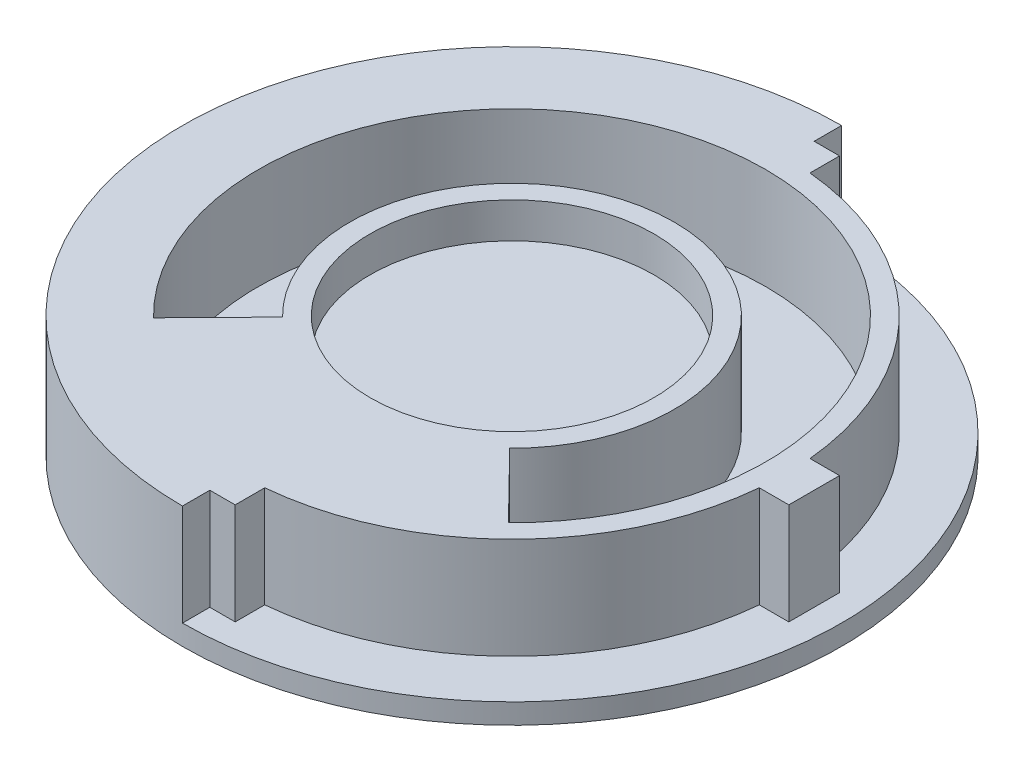
ISO-10303-21;
HEADER;
FILE_DESCRIPTION(('STEP AP214'),'2;1');
FILE_NAME('part.step','',(''),(''),'','','');
FILE_SCHEMA(('AUTOMOTIVE_DESIGN { 1 0 10303 214 1 1 1 1 }'));
ENDSEC;
DATA;
#1=APPLICATION_CONTEXT('core data for automotive mechanical design processes');
#2=APPLICATION_PROTOCOL_DEFINITION('international standard','automotive_design',2000,#1);
#3=PRODUCT_CONTEXT('',#1,'mechanical');
#4=PRODUCT('Part','Part','',(#3));
#5=PRODUCT_RELATED_PRODUCT_CATEGORY('part','',(#4));
#6=PRODUCT_DEFINITION_FORMATION('','',#4);
#7=PRODUCT_DEFINITION_CONTEXT('part definition',#1,'design');
#8=PRODUCT_DEFINITION('design','',#6,#7);
#9=PRODUCT_DEFINITION_SHAPE('','',#8);
#10=(LENGTH_UNIT() NAMED_UNIT(*) SI_UNIT(.MILLI.,.METRE.));
#11=(NAMED_UNIT(*) PLANE_ANGLE_UNIT() SI_UNIT($,.RADIAN.));
#12=(NAMED_UNIT(*) SI_UNIT($,.STERADIAN.) SOLID_ANGLE_UNIT());
#13=UNCERTAINTY_MEASURE_WITH_UNIT(LENGTH_MEASURE(1.E-05),#10,'distance_accuracy_value','');
#14=(GEOMETRIC_REPRESENTATION_CONTEXT(3) GLOBAL_UNCERTAINTY_ASSIGNED_CONTEXT((#13)) GLOBAL_UNIT_ASSIGNED_CONTEXT((#10,
#11,#12)) REPRESENTATION_CONTEXT('',''));
#15=CARTESIAN_POINT('',(0.,0.,0.));
#16=DIRECTION('',(0.,0.,1.));
#17=DIRECTION('',(1.,0.,0.));
#18=AXIS2_PLACEMENT_3D('',#15,#16,#17);
#19=CARTESIAN_POINT('',(0.,10.,0.));
#20=DIRECTION('',(0.,-1.,0.));
#21=DIRECTION('',(0.,0.,-1.));
#22=AXIS2_PLACEMENT_3D('',#19,#20,#21);
#23=CYLINDRICAL_SURFACE('',#22,14.);
#24=CARTESIAN_POINT('',(0.,0.,0.));
#25=DIRECTION('',(0.,1.,0.));
#26=DIRECTION('',(0.,0.,1.));
#27=AXIS2_PLACEMENT_3D('',#24,#25,#26);
#28=CIRCLE('',#27,14.);
#29=CARTESIAN_POINT('',(0.,0.,14.));
#30=VERTEX_POINT('',#29);
#31=EDGE_CURVE('E254',#30,#30,#28,.T.);
#32=ORIENTED_EDGE('',*,*,#31,.F.);
#33=EDGE_LOOP('',(#32));
#34=FACE_BOUND('',#33,.T.);
#35=CARTESIAN_POINT('',(0.,4.5,0.));
#36=DIRECTION('',(0.,1.,0.));
#37=DIRECTION('',(0.,0.,1.));
#38=AXIS2_PLACEMENT_3D('',#35,#36,#37);
#39=CIRCLE('',#38,14.);
#40=CARTESIAN_POINT('',(0.,4.5,14.));
#41=VERTEX_POINT('',#40);
#42=EDGE_CURVE('E180',#41,#41,#39,.T.);
#43=ORIENTED_EDGE('',*,*,#42,.T.);
#44=EDGE_LOOP('',(#43));
#45=FACE_BOUND('',#44,.T.);
#46=ADVANCED_FACE('F39',(#34,#45),#23,.F.);
#47=CARTESIAN_POINT('',(0.,0.,0.));
#48=DIRECTION('',(0.,-1.,0.));
#49=DIRECTION('',(0.,0.,-1.));
#50=AXIS2_PLACEMENT_3D('',#47,#48,#49);
#51=PLANE('',#50);
#52=DIRECTION('',(0.,0.,-1.));
#53=VECTOR('',#52,1.);
#54=CARTESIAN_POINT('',(0.,0.,-29.8));
#55=LINE('',#54,#53);
#56=CARTESIAN_POINT('',(0.,0.,-29.8));
#57=VERTEX_POINT('',#56);
#58=CARTESIAN_POINT('',(0.,0.,-32.5));
#59=VERTEX_POINT('',#58);
#60=EDGE_CURVE('E179',#57,#59,#55,.T.);
#61=ORIENTED_EDGE('',*,*,#60,.F.);
#62=DIRECTION('',(-1.,0.,0.));
#63=VECTOR('',#62,1.);
#64=CARTESIAN_POINT('',(-2.5,0.,-29.8));
#65=LINE('',#64,#63);
#66=CARTESIAN_POINT('',(2.5,0.,-29.8));
#67=VERTEX_POINT('',#66);
#68=EDGE_CURVE('E177',#67,#57,#65,.T.);
#69=ORIENTED_EDGE('',*,*,#68,.F.);
#70=DIRECTION('',(0.,0.,-1.));
#71=VECTOR('',#70,1.);
#72=CARTESIAN_POINT('',(2.5,0.,0.));
#73=LINE('',#72,#71);
#74=CARTESIAN_POINT('',(2.5,0.,-26.8840101175401));
#75=VERTEX_POINT('',#74);
#76=EDGE_CURVE('E48',#75,#67,#73,.T.);
#77=ORIENTED_EDGE('',*,*,#76,.F.);
#78=CARTESIAN_POINT('',(0.,0.,0.));
#79=DIRECTION('',(0.,1.,0.));
#80=DIRECTION('',(0.,0.,1.));
#81=AXIS2_PLACEMENT_3D('',#78,#79,#80);
#82=CIRCLE('',#81,27.);
#83=CARTESIAN_POINT('',(26.8840101175398,0.,-2.50000000000318));
#84=VERTEX_POINT('',#83);
#85=EDGE_CURVE('E207',#84,#75,#82,.T.);
#86=ORIENTED_EDGE('',*,*,#85,.F.);
#87=DIRECTION('',(-1.,0.,0.));
#88=VECTOR('',#87,1.);
#89=CARTESIAN_POINT('',(29.8000000000026,0.,-2.50000000000318));
#90=LINE('',#89,#88);
#91=CARTESIAN_POINT('',(29.8000000000026,0.,-2.50000000000318));
#92=VERTEX_POINT('',#91);
#93=EDGE_CURVE('E353',#92,#84,#90,.T.);
#94=ORIENTED_EDGE('',*,*,#93,.F.);
#95=DIRECTION('',(0.,0.,-1.));
#96=VECTOR('',#95,1.);
#97=CARTESIAN_POINT('',(29.8000000000026,0.,-2.50000000000318));
#98=LINE('',#97,#96);
#99=CARTESIAN_POINT('',(29.8000000000026,0.,2.49999999999682));
#100=VERTEX_POINT('',#99);
#101=EDGE_CURVE('E364',#100,#92,#98,.T.);
#102=ORIENTED_EDGE('',*,*,#101,.F.);
#103=DIRECTION('',(1.,0.,0.));
#104=VECTOR('',#103,1.);
#105=CARTESIAN_POINT('',(29.8000000000026,0.,2.49999999999682));
#106=LINE('',#105,#104);
#107=CARTESIAN_POINT('',(26.8840101175404,0.,2.49999999999682));
#108=VERTEX_POINT('',#107);
#109=EDGE_CURVE('E348',#108,#100,#106,.T.);
#110=ORIENTED_EDGE('',*,*,#109,.F.);
#111=CARTESIAN_POINT('',(2.50000000000583,0.,26.8840101175396));
#112=VERTEX_POINT('',#111);
#113=EDGE_CURVE('E231',#112,#108,#82,.T.);
#114=ORIENTED_EDGE('',*,*,#113,.F.);
#115=DIRECTION('',(0.,0.,-1.));
#116=VECTOR('',#115,1.);
#117=CARTESIAN_POINT('',(2.50000000000583,0.,29.7999999999995));
#118=LINE('',#117,#116);
#119=CARTESIAN_POINT('',(2.50000000000583,0.,29.7999999999995));
#120=VERTEX_POINT('',#119);
#121=EDGE_CURVE('E332',#120,#112,#118,.T.);
#122=ORIENTED_EDGE('',*,*,#121,.F.);
#123=DIRECTION('',(1.,0.,0.));
#124=VECTOR('',#123,1.);
#125=CARTESIAN_POINT('',(2.50000000000583,0.,29.7999999999995));
#126=LINE('',#125,#124);
#127=CARTESIAN_POINT('',(0.,0.,29.7999999999995));
#128=VERTEX_POINT('',#127);
#129=EDGE_CURVE('E55',#128,#120,#126,.T.);
#130=ORIENTED_EDGE('',*,*,#129,.F.);
#131=DIRECTION('',(0.,0.,-1.));
#132=VECTOR('',#131,1.);
#133=CARTESIAN_POINT('',(0.,0.,29.7999999999995));
#134=LINE('',#133,#132);
#135=CARTESIAN_POINT('',(0.,0.,32.5));
#136=VERTEX_POINT('',#135);
#137=EDGE_CURVE('E284',#136,#128,#134,.T.);
#138=ORIENTED_EDGE('',*,*,#137,.F.);
#139=CARTESIAN_POINT('',(0.,0.,0.));
#140=DIRECTION('',(0.,-1.,0.));
#141=DIRECTION('',(0.,0.,-1.));
#142=AXIS2_PLACEMENT_3D('',#139,#140,#141);
#143=CIRCLE('',#142,32.5);
#144=EDGE_CURVE('E202',#59,#136,#143,.T.);
#145=ORIENTED_EDGE('',*,*,#144,.F.);
#146=EDGE_LOOP('',(#61,#69,#77,#86,#94,#102,#110,#114,#122,#130,#138,#145));
#147=FACE_BOUND('',#146,.T.);
#148=ADVANCED_FACE('F273',(#147),#51,.F.);
#149=CARTESIAN_POINT('',(-2.5,10.,-29.8));
#150=DIRECTION('',(0.,0.,1.));
#151=DIRECTION('',(1.,0.,0.));
#152=AXIS2_PLACEMENT_3D('',#149,#150,#151);
#153=PLANE('',#152);
#154=DIRECTION('',(0.,-1.,0.));
#155=VECTOR('',#154,1.);
#156=CARTESIAN_POINT('',(0.,82.6722092687432,-29.8));
#157=LINE('',#156,#155);
#158=CARTESIAN_POINT('',(0.,9.99999999999999,-29.8));
#159=VERTEX_POINT('',#158);
#160=EDGE_CURVE('E160',#159,#57,#157,.T.);
#161=ORIENTED_EDGE('',*,*,#160,.F.);
#162=DIRECTION('',(-1.,0.,0.));
#163=VECTOR('',#162,1.);
#164=CARTESIAN_POINT('',(-2.5,10.,-29.8));
#165=LINE('',#164,#163);
#166=CARTESIAN_POINT('',(2.5,10.,-29.8));
#167=VERTEX_POINT('',#166);
#168=EDGE_CURVE('E175',#167,#159,#165,.T.);
#169=ORIENTED_EDGE('',*,*,#168,.F.);
#170=DIRECTION('',(0.,-1.,0.));
#171=VECTOR('',#170,1.);
#172=CARTESIAN_POINT('',(2.5,10.,-29.8));
#173=LINE('',#172,#171);
#174=EDGE_CURVE('E187',#167,#67,#173,.T.);
#175=ORIENTED_EDGE('',*,*,#174,.T.);
#176=ORIENTED_EDGE('',*,*,#68,.T.);
#177=EDGE_LOOP('',(#161,#169,#175,#176));
#178=FACE_BOUND('',#177,.T.);
#179=ADVANCED_FACE('F173',(#178),#153,.F.);
#180=CARTESIAN_POINT('',(2.50000000000583,10.,29.7999999999995));
#181=DIRECTION('',(0.,0.,-1.));
#182=DIRECTION('',(-1.,0.,0.));
#183=AXIS2_PLACEMENT_3D('',#180,#181,#182);
#184=PLANE('',#183);
#185=DIRECTION('',(0.,-1.,0.));
#186=VECTOR('',#185,1.);
#187=CARTESIAN_POINT('',(0.,82.6722092687432,29.7999999999995));
#188=LINE('',#187,#186);
#189=CARTESIAN_POINT('',(0.,9.99999999999999,29.7999999999995));
#190=VERTEX_POINT('',#189);
#191=EDGE_CURVE('E168',#190,#128,#188,.T.);
#192=ORIENTED_EDGE('',*,*,#191,.T.);
#193=ORIENTED_EDGE('',*,*,#129,.T.);
#194=DIRECTION('',(0.,-1.,0.));
#195=VECTOR('',#194,1.);
#196=CARTESIAN_POINT('',(2.50000000000583,10.,29.7999999999995));
#197=LINE('',#196,#195);
#198=CARTESIAN_POINT('',(2.50000000000583,10.,29.7999999999995));
#199=VERTEX_POINT('',#198);
#200=EDGE_CURVE('E336',#199,#120,#197,.T.);
#201=ORIENTED_EDGE('',*,*,#200,.F.);
#202=DIRECTION('',(1.,0.,0.));
#203=VECTOR('',#202,1.);
#204=CARTESIAN_POINT('',(2.50000000000583,10.,29.7999999999995));
#205=LINE('',#204,#203);
#206=EDGE_CURVE('E328',#190,#199,#205,.T.);
#207=ORIENTED_EDGE('',*,*,#206,.F.);
#208=EDGE_LOOP('',(#192,#193,#201,#207));
#209=FACE_BOUND('',#208,.T.);
#210=ADVANCED_FACE('F404',(#209),#184,.F.);
#211=CARTESIAN_POINT('',(0.,10.,0.));
#212=DIRECTION('',(0.,-1.,0.));
#213=DIRECTION('',(0.,0.,-1.));
#214=AXIS2_PLACEMENT_3D('',#211,#212,#213);
#215=CYLINDRICAL_SURFACE('',#214,27.);
#216=DIRECTION('',(0.,-1.,0.));
#217=VECTOR('',#216,1.);
#218=CARTESIAN_POINT('',(2.50000000000583,10.,26.8840101175396));
#219=LINE('',#218,#217);
#220=CARTESIAN_POINT('',(2.50000000000583,10.,26.8840101175396));
#221=VERTEX_POINT('',#220);
#222=EDGE_CURVE('E345',#112,#221,#219,.F.);
#223=ORIENTED_EDGE('',*,*,#222,.F.);
#224=ORIENTED_EDGE('',*,*,#113,.T.);
#225=DIRECTION('',(0.,-1.,0.));
#226=VECTOR('',#225,1.);
#227=CARTESIAN_POINT('',(26.8840101175404,10.,2.49999999999682));
#228=LINE('',#227,#226);
#229=CARTESIAN_POINT('',(26.8840101175404,10.,2.49999999999682));
#230=VERTEX_POINT('',#229);
#231=EDGE_CURVE('E197',#230,#108,#228,.T.);
#232=ORIENTED_EDGE('',*,*,#231,.F.);
#233=CARTESIAN_POINT('',(0.,10.,0.));
#234=DIRECTION('',(0.,1.,0.));
#235=DIRECTION('',(0.,0.,1.));
#236=AXIS2_PLACEMENT_3D('',#233,#234,#235);
#237=CIRCLE('',#236,27.);
#238=EDGE_CURVE('E63',#221,#230,#237,.T.);
#239=ORIENTED_EDGE('',*,*,#238,.F.);
#240=EDGE_LOOP('',(#223,#224,#232,#239));
#241=FACE_BOUND('',#240,.T.);
#242=ADVANCED_FACE('F41',(#241),#215,.T.);
#243=DIRECTION('',(0.,-1.,0.));
#244=VECTOR('',#243,1.);
#245=CARTESIAN_POINT('',(26.8840101175398,10.,-2.50000000000318));
#246=LINE('',#245,#244);
#247=CARTESIAN_POINT('',(26.8840101175398,10.,-2.50000000000318));
#248=VERTEX_POINT('',#247);
#249=EDGE_CURVE('E378',#84,#248,#246,.F.);
#250=ORIENTED_EDGE('',*,*,#249,.F.);
#251=ORIENTED_EDGE('',*,*,#85,.T.);
#252=DIRECTION('',(0.,-1.,0.));
#253=VECTOR('',#252,1.);
#254=CARTESIAN_POINT('',(2.5,10.,-26.8840101175401));
#255=LINE('',#254,#253);
#256=CARTESIAN_POINT('',(2.5,10.,-26.8840101175401));
#257=VERTEX_POINT('',#256);
#258=EDGE_CURVE('E191',#257,#75,#255,.T.);
#259=ORIENTED_EDGE('',*,*,#258,.F.);
#260=EDGE_CURVE('E259',#248,#257,#237,.T.);
#261=ORIENTED_EDGE('',*,*,#260,.F.);
#262=EDGE_LOOP('',(#250,#251,#259,#261));
#263=FACE_BOUND('',#262,.T.);
#264=ADVANCED_FACE('F441',(#263),#215,.T.);
#265=CARTESIAN_POINT('',(0.,10.,0.));
#266=DIRECTION('',(0.,1.,0.));
#267=DIRECTION('',(0.,0.,1.));
#268=AXIS2_PLACEMENT_3D('',#265,#266,#267);
#269=PLANE('',#268);
#270=ORIENTED_EDGE('',*,*,#168,.T.);
#271=DIRECTION('',(0.,0.,-1.));
#272=VECTOR('',#271,1.);
#273=CARTESIAN_POINT('',(0.,9.99999999999999,-29.8));
#274=LINE('',#273,#272);
#275=CARTESIAN_POINT('',(0.,9.99999999999999,-32.5));
#276=VERTEX_POINT('',#275);
#277=EDGE_CURVE('E156',#159,#276,#274,.T.);
#278=ORIENTED_EDGE('',*,*,#277,.T.);
#279=CARTESIAN_POINT('',(0.,9.99999999999999,0.));
#280=DIRECTION('',(0.,1.,0.));
#281=DIRECTION('',(0.,0.,1.));
#282=AXIS2_PLACEMENT_3D('',#279,#280,#281);
#283=CIRCLE('',#282,32.5);
#284=CARTESIAN_POINT('',(0.,9.99999999999999,32.5));
#285=VERTEX_POINT('',#284);
#286=EDGE_CURVE('E167',#276,#285,#283,.T.);
#287=ORIENTED_EDGE('',*,*,#286,.T.);
#288=DIRECTION('',(0.,0.,-1.));
#289=VECTOR('',#288,1.);
#290=CARTESIAN_POINT('',(0.,9.99999999999999,29.7999999999995));
#291=LINE('',#290,#289);
#292=EDGE_CURVE('E286',#285,#190,#291,.T.);
#293=ORIENTED_EDGE('',*,*,#292,.T.);
#294=ORIENTED_EDGE('',*,*,#206,.T.);
#295=DIRECTION('',(0.,0.,-1.));
#296=VECTOR('',#295,1.);
#297=CARTESIAN_POINT('',(2.50000000000583,10.,29.7999999999995));
#298=LINE('',#297,#296);
#299=EDGE_CURVE('E331',#199,#221,#298,.T.);
#300=ORIENTED_EDGE('',*,*,#299,.T.);
#301=ORIENTED_EDGE('',*,*,#238,.T.);
#302=DIRECTION('',(1.,0.,0.));
#303=VECTOR('',#302,1.);
#304=CARTESIAN_POINT('',(29.8000000000026,10.,2.49999999999682));
#305=LINE('',#304,#303);
#306=CARTESIAN_POINT('',(29.8000000000026,10.,2.49999999999682));
#307=VERTEX_POINT('',#306);
#308=EDGE_CURVE('E349',#230,#307,#305,.T.);
#309=ORIENTED_EDGE('',*,*,#308,.T.);
#310=DIRECTION('',(0.,0.,-1.));
#311=VECTOR('',#310,1.);
#312=CARTESIAN_POINT('',(29.8000000000026,10.,-2.50000000000318));
#313=LINE('',#312,#311);
#314=CARTESIAN_POINT('',(29.8000000000026,10.,-2.50000000000318));
#315=VERTEX_POINT('',#314);
#316=EDGE_CURVE('E352',#307,#315,#313,.T.);
#317=ORIENTED_EDGE('',*,*,#316,.T.);
#318=DIRECTION('',(-1.,0.,0.));
#319=VECTOR('',#318,1.);
#320=CARTESIAN_POINT('',(29.8000000000026,10.,-2.50000000000318));
#321=LINE('',#320,#319);
#322=EDGE_CURVE('E356',#315,#248,#321,.T.);
#323=ORIENTED_EDGE('',*,*,#322,.T.);
#324=ORIENTED_EDGE('',*,*,#260,.T.);
#325=DIRECTION('',(0.,0.,-1.));
#326=VECTOR('',#325,1.);
#327=CARTESIAN_POINT('',(2.5,10.,-29.8));
#328=LINE('',#327,#326);
#329=EDGE_CURVE('E185',#257,#167,#328,.T.);
#330=ORIENTED_EDGE('',*,*,#329,.T.);
#331=EDGE_LOOP('',(#270,#278,#287,#293,#294,#300,#301,#309,#317,#323,#324,#330));
#332=FACE_BOUND('',#331,.T.);
#333=CARTESIAN_POINT('',(0.,10.,0.));
#334=DIRECTION('',(0.,1.,0.));
#335=DIRECTION('',(0.,0.,1.));
#336=AXIS2_PLACEMENT_3D('',#333,#334,#335);
#337=CIRCLE('',#336,14.);
#338=CARTESIAN_POINT('',(0.,10.,14.));
#339=VERTEX_POINT('',#338);
#340=EDGE_CURVE('E255',#339,#339,#337,.T.);
#341=ORIENTED_EDGE('',*,*,#340,.F.);
#342=EDGE_LOOP('',(#341));
#343=FACE_BOUND('',#342,.T.);
#344=DIRECTION('',(0.7,0.,-0.714142842854285));
#345=VECTOR('',#344,1.);
#346=CARTESIAN_POINT('',(-17.5,10.,17.8535710713571));
#347=LINE('',#346,#345);
#348=CARTESIAN_POINT('',(-17.5,10.,17.8535710713571));
#349=VERTEX_POINT('',#348);
#350=CARTESIAN_POINT('',(-11.2,10.,11.4262854856686));
#351=VERTEX_POINT('',#350);
#352=EDGE_CURVE('E214',#349,#351,#347,.T.);
#353=ORIENTED_EDGE('',*,*,#352,.F.);
#354=CARTESIAN_POINT('',(0.,10.,0.));
#355=DIRECTION('',(0.,1.,0.));
#356=DIRECTION('',(0.,0.,1.));
#357=AXIS2_PLACEMENT_3D('',#354,#355,#356);
#358=CIRCLE('',#357,25.);
#359=CARTESIAN_POINT('',(17.5,10.,17.8535710713571));
#360=VERTEX_POINT('',#359);
#361=EDGE_CURVE('E211',#360,#349,#358,.T.);
#362=ORIENTED_EDGE('',*,*,#361,.F.);
#363=DIRECTION('',(0.7,0.,0.714142842854285));
#364=VECTOR('',#363,1.);
#365=CARTESIAN_POINT('',(17.5,10.,17.8535710713571));
#366=LINE('',#365,#364);
#367=CARTESIAN_POINT('',(11.2,10.,11.4262854856686));
#368=VERTEX_POINT('',#367);
#369=EDGE_CURVE('E222',#368,#360,#366,.T.);
#370=ORIENTED_EDGE('',*,*,#369,.F.);
#371=CARTESIAN_POINT('',(0.,10.,0.));
#372=DIRECTION('',(0.,-1.,0.));
#373=DIRECTION('',(0.,0.,1.));
#374=AXIS2_PLACEMENT_3D('',#371,#372,#373);
#375=CIRCLE('',#374,16.);
#376=EDGE_CURVE('E218',#351,#368,#375,.T.);
#377=ORIENTED_EDGE('',*,*,#376,.F.);
#378=EDGE_LOOP('',(#353,#362,#370,#377));
#379=FACE_BOUND('',#378,.T.);
#380=ADVANCED_FACE('F182',(#332,#343,#379),#269,.T.);
#381=CARTESIAN_POINT('',(0.,6.5,0.));
#382=DIRECTION('',(0.,1.,0.));
#383=DIRECTION('',(0.,0.,1.));
#384=AXIS2_PLACEMENT_3D('',#381,#382,#383);
#385=CIRCLE('',#384,14.);
#386=CARTESIAN_POINT('',(0.,6.5,14.));
#387=VERTEX_POINT('',#386);
#388=EDGE_CURVE('E11',#387,#387,#385,.T.);
#389=ORIENTED_EDGE('',*,*,#388,.F.);
#390=EDGE_LOOP('',(#389));
#391=FACE_BOUND('',#390,.T.);
#392=ORIENTED_EDGE('',*,*,#340,.T.);
#393=EDGE_LOOP('',(#392));
#394=FACE_BOUND('',#393,.T.);
#395=ADVANCED_FACE('F422',(#391,#394),#23,.F.);
#396=CARTESIAN_POINT('',(0.,10.,0.));
#397=DIRECTION('',(0.,-1.,0.));
#398=DIRECTION('',(0.,0.,-1.));
#399=AXIS2_PLACEMENT_3D('',#396,#397,#398);
#400=CYLINDRICAL_SURFACE('',#399,25.);
#401=CARTESIAN_POINT('',(0.,0.,0.));
#402=DIRECTION('',(0.,1.,0.));
#403=DIRECTION('',(0.,0.,1.));
#404=AXIS2_PLACEMENT_3D('',#401,#402,#403);
#405=CIRCLE('',#404,25.);
#406=CARTESIAN_POINT('',(17.5,0.,17.8535710713571));
#407=VERTEX_POINT('',#406);
#408=CARTESIAN_POINT('',(-17.5,0.,17.8535710713571));
#409=VERTEX_POINT('',#408);
#410=EDGE_CURVE('E226',#407,#409,#405,.T.);
#411=ORIENTED_EDGE('',*,*,#410,.F.);
#412=DIRECTION('',(0.,-1.,0.));
#413=VECTOR('',#412,1.);
#414=CARTESIAN_POINT('',(17.5,10.,17.8535710713571));
#415=LINE('',#414,#413);
#416=EDGE_CURVE('E225',#360,#407,#415,.T.);
#417=ORIENTED_EDGE('',*,*,#416,.F.);
#418=ORIENTED_EDGE('',*,*,#361,.T.);
#419=DIRECTION('',(0.,-1.,0.));
#420=VECTOR('',#419,1.);
#421=CARTESIAN_POINT('',(-17.5,10.,17.8535710713571));
#422=LINE('',#421,#420);
#423=EDGE_CURVE('E250',#349,#409,#422,.T.);
#424=ORIENTED_EDGE('',*,*,#423,.T.);
#425=EDGE_LOOP('',(#411,#417,#418,#424));
#426=FACE_BOUND('',#425,.T.);
#427=ADVANCED_FACE('F432',(#426),#400,.F.);
#428=CARTESIAN_POINT('',(-17.5,10.,17.8535710713571));
#429=DIRECTION('',(-0.714142842854285,0.,-0.7));
#430=DIRECTION('',(-0.7,0.,0.714142842854285));
#431=AXIS2_PLACEMENT_3D('',#428,#429,#430);
#432=PLANE('',#431);
#433=DIRECTION('',(0.7,0.,-0.714142842854285));
#434=VECTOR('',#433,1.);
#435=CARTESIAN_POINT('',(-17.5,0.,17.8535710713571));
#436=LINE('',#435,#434);
#437=CARTESIAN_POINT('',(-11.2,0.,11.4262854856686));
#438=VERTEX_POINT('',#437);
#439=EDGE_CURVE('E230',#409,#438,#436,.T.);
#440=ORIENTED_EDGE('',*,*,#439,.F.);
#441=ORIENTED_EDGE('',*,*,#423,.F.);
#442=ORIENTED_EDGE('',*,*,#352,.T.);
#443=DIRECTION('',(0.,-1.,0.));
#444=VECTOR('',#443,1.);
#445=CARTESIAN_POINT('',(-11.2,10.,11.4262854856686));
#446=LINE('',#445,#444);
#447=EDGE_CURVE('E247',#351,#438,#446,.T.);
#448=ORIENTED_EDGE('',*,*,#447,.T.);
#449=EDGE_LOOP('',(#440,#441,#442,#448));
#450=FACE_BOUND('',#449,.T.);
#451=ADVANCED_FACE('F438',(#450),#432,.T.);
#452=CARTESIAN_POINT('',(0.,10.,0.));
#453=DIRECTION('',(0.,-1.,0.));
#454=DIRECTION('',(0.,0.,-1.));
#455=AXIS2_PLACEMENT_3D('',#452,#453,#454);
#456=CYLINDRICAL_SURFACE('',#455,16.);
#457=CARTESIAN_POINT('',(0.,0.,0.));
#458=DIRECTION('',(0.,-1.,0.));
#459=DIRECTION('',(0.,0.,1.));
#460=AXIS2_PLACEMENT_3D('',#457,#458,#459);
#461=CIRCLE('',#460,16.);
#462=CARTESIAN_POINT('',(11.2,0.,11.4262854856686));
#463=VERTEX_POINT('',#462);
#464=EDGE_CURVE('E235',#438,#463,#461,.T.);
#465=ORIENTED_EDGE('',*,*,#464,.F.);
#466=ORIENTED_EDGE('',*,*,#447,.F.);
#467=ORIENTED_EDGE('',*,*,#376,.T.);
#468=DIRECTION('',(0.,-1.,0.));
#469=VECTOR('',#468,1.);
#470=CARTESIAN_POINT('',(11.2,10.,11.4262854856686));
#471=LINE('',#470,#469);
#472=EDGE_CURVE('E244',#368,#463,#471,.T.);
#473=ORIENTED_EDGE('',*,*,#472,.T.);
#474=EDGE_LOOP('',(#465,#466,#467,#473));
#475=FACE_BOUND('',#474,.T.);
#476=ADVANCED_FACE('F455',(#475),#456,.T.);
#477=CARTESIAN_POINT('',(17.5,10.,17.8535710713571));
#478=DIRECTION('',(0.714142842854285,0.,-0.7));
#479=DIRECTION('',(-0.7,0.,-0.714142842854285));
#480=AXIS2_PLACEMENT_3D('',#477,#478,#479);
#481=PLANE('',#480);
#482=DIRECTION('',(0.7,0.,0.714142842854285));
#483=VECTOR('',#482,1.);
#484=CARTESIAN_POINT('',(17.5,0.,17.8535710713571));
#485=LINE('',#484,#483);
#486=EDGE_CURVE('E215',#463,#407,#485,.T.);
#487=ORIENTED_EDGE('',*,*,#486,.F.);
#488=ORIENTED_EDGE('',*,*,#472,.F.);
#489=ORIENTED_EDGE('',*,*,#369,.T.);
#490=ORIENTED_EDGE('',*,*,#416,.T.);
#491=EDGE_LOOP('',(#487,#488,#489,#490));
#492=FACE_BOUND('',#491,.T.);
#493=ADVANCED_FACE('F461',(#492),#481,.T.);
#494=ORIENTED_EDGE('',*,*,#486,.T.);
#495=ORIENTED_EDGE('',*,*,#410,.T.);
#496=ORIENTED_EDGE('',*,*,#439,.T.);
#497=ORIENTED_EDGE('',*,*,#464,.T.);
#498=EDGE_LOOP('',(#494,#495,#496,#497));
#499=FACE_BOUND('',#498,.T.);
#500=ADVANCED_FACE('F428',(#499),#51,.F.);
#501=CARTESIAN_POINT('',(0.,-2.,0.));
#502=DIRECTION('',(0.,-1.,0.));
#503=DIRECTION('',(0.,0.,-1.));
#504=AXIS2_PLACEMENT_3D('',#501,#502,#503);
#505=PLANE('',#504);
#506=CARTESIAN_POINT('',(0.,-2.,-7.));
#507=DIRECTION('',(0.,-1.,0.));
#508=DIRECTION('',(0.,0.,-1.));
#509=AXIS2_PLACEMENT_3D('',#506,#507,#508);
#510=CIRCLE('',#509,0.9);
#511=CARTESIAN_POINT('',(0.,-2.,-7.9));
#512=VERTEX_POINT('',#511);
#513=EDGE_CURVE('E297',#512,#512,#510,.T.);
#514=ORIENTED_EDGE('',*,*,#513,.F.);
#515=EDGE_LOOP('',(#514));
#516=FACE_BOUND('',#515,.T.);
#517=CARTESIAN_POINT('',(-7.,-2.,0.));
#518=DIRECTION('',(0.,-1.,0.));
#519=DIRECTION('',(0.,0.,-1.));
#520=AXIS2_PLACEMENT_3D('',#517,#518,#519);
#521=CIRCLE('',#520,0.9);
#522=CARTESIAN_POINT('',(-7.,-2.,-0.899999999999976));
#523=VERTEX_POINT('',#522);
#524=EDGE_CURVE('E306',#523,#523,#521,.T.);
#525=ORIENTED_EDGE('',*,*,#524,.F.);
#526=EDGE_LOOP('',(#525));
#527=FACE_BOUND('',#526,.T.);
#528=CARTESIAN_POINT('',(0.,-2.,7.));
#529=DIRECTION('',(0.,-1.,0.));
#530=DIRECTION('',(0.,0.,-1.));
#531=AXIS2_PLACEMENT_3D('',#528,#529,#530);
#532=CIRCLE('',#531,0.9);
#533=CARTESIAN_POINT('',(0.,-2.,6.1));
#534=VERTEX_POINT('',#533);
#535=EDGE_CURVE('E314',#534,#534,#532,.T.);
#536=ORIENTED_EDGE('',*,*,#535,.F.);
#537=EDGE_LOOP('',(#536));
#538=FACE_BOUND('',#537,.T.);
#539=CARTESIAN_POINT('',(7.,-2.,0.));
#540=DIRECTION('',(0.,-1.,0.));
#541=DIRECTION('',(0.,0.,-1.));
#542=AXIS2_PLACEMENT_3D('',#539,#540,#541);
#543=CIRCLE('',#542,0.9);
#544=CARTESIAN_POINT('',(7.,-2.,-0.900000000000073));
#545=VERTEX_POINT('',#544);
#546=EDGE_CURVE('E290',#545,#545,#543,.T.);
#547=ORIENTED_EDGE('',*,*,#546,.F.);
#548=EDGE_LOOP('',(#547));
#549=FACE_BOUND('',#548,.T.);
#550=CARTESIAN_POINT('',(0.,-2.,0.));
#551=DIRECTION('',(0.,-1.,0.));
#552=DIRECTION('',(0.,0.,-1.));
#553=AXIS2_PLACEMENT_3D('',#550,#551,#552);
#554=CIRCLE('',#553,32.5);
#555=CARTESIAN_POINT('',(0.,-2.,-32.5));
#556=VERTEX_POINT('',#555);
#557=EDGE_CURVE('E203',#556,#556,#554,.T.);
#558=ORIENTED_EDGE('',*,*,#557,.T.);
#559=EDGE_LOOP('',(#558));
#560=FACE_BOUND('',#559,.T.);
#561=ADVANCED_FACE('F468',(#516,#527,#538,#549,#560),#505,.T.);
#562=CARTESIAN_POINT('',(0.,-2.,0.));
#563=DIRECTION('',(0.,1.,0.));
#564=DIRECTION('',(0.,0.,1.));
#565=AXIS2_PLACEMENT_3D('',#562,#563,#564);
#566=CYLINDRICAL_SURFACE('',#565,32.5);
#567=ORIENTED_EDGE('',*,*,#557,.F.);
#568=EDGE_LOOP('',(#567));
#569=FACE_BOUND('',#568,.T.);
#570=ORIENTED_EDGE('',*,*,#144,.T.);
#571=DIRECTION('',(0.,-1.,0.));
#572=VECTOR('',#571,1.);
#573=CARTESIAN_POINT('',(0.,82.6722092687432,32.5));
#574=LINE('',#573,#572);
#575=EDGE_CURVE('E280',#285,#136,#574,.T.);
#576=ORIENTED_EDGE('',*,*,#575,.F.);
#577=ORIENTED_EDGE('',*,*,#286,.F.);
#578=DIRECTION('',(0.,-1.,0.));
#579=VECTOR('',#578,1.);
#580=CARTESIAN_POINT('',(0.,82.6722092687432,-32.5));
#581=LINE('',#580,#579);
#582=EDGE_CURVE('E162',#276,#59,#581,.T.);
#583=ORIENTED_EDGE('',*,*,#582,.T.);
#584=EDGE_LOOP('',(#570,#576,#577,#583));
#585=FACE_BOUND('',#584,.T.);
#586=ADVANCED_FACE('F403',(#569,#585),#566,.T.);
#587=CARTESIAN_POINT('',(0.,0.,-7.));
#588=DIRECTION('',(0.,-1.,0.));
#589=DIRECTION('',(0.,0.,-1.));
#590=AXIS2_PLACEMENT_3D('',#587,#588,#589);
#591=CIRCLE('',#590,0.9);
#592=CARTESIAN_POINT('',(0.,0.,-7.9));
#593=VERTEX_POINT('',#592);
#594=EDGE_CURVE('E301',#593,#593,#591,.F.);
#595=ORIENTED_EDGE('',*,*,#594,.F.);
#596=EDGE_LOOP('',(#595));
#597=FACE_BOUND('',#596,.T.);
#598=CARTESIAN_POINT('',(-7.,0.,0.));
#599=DIRECTION('',(0.,-1.,0.));
#600=DIRECTION('',(0.,0.,-1.));
#601=AXIS2_PLACEMENT_3D('',#598,#599,#600);
#602=CIRCLE('',#601,0.9);
#603=CARTESIAN_POINT('',(-7.,0.,-0.899999999999976));
#604=VERTEX_POINT('',#603);
#605=EDGE_CURVE('E302',#604,#604,#602,.F.);
#606=ORIENTED_EDGE('',*,*,#605,.F.);
#607=EDGE_LOOP('',(#606));
#608=FACE_BOUND('',#607,.T.);
#609=CARTESIAN_POINT('',(0.,0.,7.));
#610=DIRECTION('',(0.,-1.,0.));
#611=DIRECTION('',(0.,0.,-1.));
#612=AXIS2_PLACEMENT_3D('',#609,#610,#611);
#613=CIRCLE('',#612,0.9);
#614=CARTESIAN_POINT('',(0.,0.,6.1));
#615=VERTEX_POINT('',#614);
#616=EDGE_CURVE('E310',#615,#615,#613,.F.);
#617=ORIENTED_EDGE('',*,*,#616,.F.);
#618=EDGE_LOOP('',(#617));
#619=FACE_BOUND('',#618,.T.);
#620=CARTESIAN_POINT('',(7.,0.,0.));
#621=DIRECTION('',(0.,-1.,0.));
#622=DIRECTION('',(0.,0.,-1.));
#623=AXIS2_PLACEMENT_3D('',#620,#621,#622);
#624=CIRCLE('',#623,0.9);
#625=CARTESIAN_POINT('',(7.,0.,-0.900000000000073));
#626=VERTEX_POINT('',#625);
#627=EDGE_CURVE('E318',#626,#626,#624,.F.);
#628=ORIENTED_EDGE('',*,*,#627,.F.);
#629=EDGE_LOOP('',(#628));
#630=FACE_BOUND('',#629,.T.);
#631=ORIENTED_EDGE('',*,*,#31,.T.);
#632=EDGE_LOOP('',(#631));
#633=FACE_BOUND('',#632,.T.);
#634=ADVANCED_FACE('F427',(#597,#608,#619,#630,#633),#51,.F.);
#635=CARTESIAN_POINT('',(2.5,10.,-29.8));
#636=DIRECTION('',(-1.,0.,0.));
#637=DIRECTION('',(0.,0.,1.));
#638=AXIS2_PLACEMENT_3D('',#635,#636,#637);
#639=PLANE('',#638);
#640=ORIENTED_EDGE('',*,*,#329,.F.);
#641=ORIENTED_EDGE('',*,*,#258,.T.);
#642=ORIENTED_EDGE('',*,*,#76,.T.);
#643=ORIENTED_EDGE('',*,*,#174,.F.);
#644=EDGE_LOOP('',(#640,#641,#642,#643));
#645=FACE_BOUND('',#644,.T.);
#646=ADVANCED_FACE('F270',(#645),#639,.F.);
#647=CARTESIAN_POINT('',(29.8000000000026,10.,2.49999999999682));
#648=DIRECTION('',(0.,0.,-1.));
#649=DIRECTION('',(-1.,0.,0.));
#650=AXIS2_PLACEMENT_3D('',#647,#648,#649);
#651=PLANE('',#650);
#652=ORIENTED_EDGE('',*,*,#308,.F.);
#653=ORIENTED_EDGE('',*,*,#231,.T.);
#654=ORIENTED_EDGE('',*,*,#109,.T.);
#655=DIRECTION('',(0.,-1.,0.));
#656=VECTOR('',#655,1.);
#657=CARTESIAN_POINT('',(29.8000000000026,10.,2.49999999999682));
#658=LINE('',#657,#656);
#659=EDGE_CURVE('E374',#307,#100,#658,.T.);
#660=ORIENTED_EDGE('',*,*,#659,.F.);
#661=EDGE_LOOP('',(#652,#653,#654,#660));
#662=FACE_BOUND('',#661,.T.);
#663=ADVANCED_FACE('F385',(#662),#651,.F.);
#664=CARTESIAN_POINT('',(29.8000000000026,10.,-2.50000000000318));
#665=DIRECTION('',(0.,0.,1.));
#666=DIRECTION('',(1.,0.,0.));
#667=AXIS2_PLACEMENT_3D('',#664,#665,#666);
#668=PLANE('',#667);
#669=ORIENTED_EDGE('',*,*,#93,.T.);
#670=ORIENTED_EDGE('',*,*,#249,.T.);
#671=ORIENTED_EDGE('',*,*,#322,.F.);
#672=DIRECTION('',(0.,-1.,0.));
#673=VECTOR('',#672,1.);
#674=CARTESIAN_POINT('',(29.8000000000026,10.,-2.50000000000318));
#675=LINE('',#674,#673);
#676=EDGE_CURVE('E360',#315,#92,#675,.T.);
#677=ORIENTED_EDGE('',*,*,#676,.T.);
#678=EDGE_LOOP('',(#669,#670,#671,#677));
#679=FACE_BOUND('',#678,.T.);
#680=ADVANCED_FACE('F394',(#679),#668,.F.);
#681=CARTESIAN_POINT('',(29.8000000000026,10.,-2.50000000000318));
#682=DIRECTION('',(-1.,0.,0.));
#683=DIRECTION('',(0.,0.,1.));
#684=AXIS2_PLACEMENT_3D('',#681,#682,#683);
#685=PLANE('',#684);
#686=ORIENTED_EDGE('',*,*,#101,.T.);
#687=ORIENTED_EDGE('',*,*,#676,.F.);
#688=ORIENTED_EDGE('',*,*,#316,.F.);
#689=ORIENTED_EDGE('',*,*,#659,.T.);
#690=EDGE_LOOP('',(#686,#687,#688,#689));
#691=FACE_BOUND('',#690,.T.);
#692=ADVANCED_FACE('F390',(#691),#685,.F.);
#693=CARTESIAN_POINT('',(2.50000000000583,10.,29.7999999999995));
#694=DIRECTION('',(-1.,0.,0.));
#695=DIRECTION('',(0.,0.,1.));
#696=AXIS2_PLACEMENT_3D('',#693,#694,#695);
#697=PLANE('',#696);
#698=ORIENTED_EDGE('',*,*,#121,.T.);
#699=ORIENTED_EDGE('',*,*,#222,.T.);
#700=ORIENTED_EDGE('',*,*,#299,.F.);
#701=ORIENTED_EDGE('',*,*,#200,.T.);
#702=EDGE_LOOP('',(#698,#699,#700,#701));
#703=FACE_BOUND('',#702,.T.);
#704=ADVANCED_FACE('F398',(#703),#697,.F.);
#705=CARTESIAN_POINT('',(7.,10.001,0.));
#706=DIRECTION('',(0.,-1.,0.));
#707=DIRECTION('',(0.,0.,-1.));
#708=AXIS2_PLACEMENT_3D('',#705,#706,#707);
#709=CYLINDRICAL_SURFACE('',#708,0.9);
#710=ORIENTED_EDGE('',*,*,#546,.T.);
#711=EDGE_LOOP('',(#710));
#712=FACE_BOUND('',#711,.T.);
#713=ORIENTED_EDGE('',*,*,#627,.T.);
#714=EDGE_LOOP('',(#713));
#715=FACE_BOUND('',#714,.T.);
#716=ADVANCED_FACE('F553',(#712,#715),#709,.F.);
#717=CARTESIAN_POINT('',(0.,10.001,7.));
#718=DIRECTION('',(0.,-1.,0.));
#719=DIRECTION('',(0.,0.,-1.));
#720=AXIS2_PLACEMENT_3D('',#717,#718,#719);
#721=CYLINDRICAL_SURFACE('',#720,0.9);
#722=ORIENTED_EDGE('',*,*,#535,.T.);
#723=EDGE_LOOP('',(#722));
#724=FACE_BOUND('',#723,.T.);
#725=ORIENTED_EDGE('',*,*,#616,.T.);
#726=EDGE_LOOP('',(#725));
#727=FACE_BOUND('',#726,.T.);
#728=ADVANCED_FACE('F576',(#724,#727),#721,.F.);
#729=CARTESIAN_POINT('',(-7.,10.001,0.));
#730=DIRECTION('',(0.,-1.,0.));
#731=DIRECTION('',(0.,0.,-1.));
#732=AXIS2_PLACEMENT_3D('',#729,#730,#731);
#733=CYLINDRICAL_SURFACE('',#732,0.9);
#734=ORIENTED_EDGE('',*,*,#524,.T.);
#735=EDGE_LOOP('',(#734));
#736=FACE_BOUND('',#735,.T.);
#737=ORIENTED_EDGE('',*,*,#605,.T.);
#738=EDGE_LOOP('',(#737));
#739=FACE_BOUND('',#738,.T.);
#740=ADVANCED_FACE('F586',(#736,#739),#733,.F.);
#741=CARTESIAN_POINT('',(0.,10.001,-7.));
#742=DIRECTION('',(0.,-1.,0.));
#743=DIRECTION('',(0.,0.,-1.));
#744=AXIS2_PLACEMENT_3D('',#741,#742,#743);
#745=CYLINDRICAL_SURFACE('',#744,0.9);
#746=ORIENTED_EDGE('',*,*,#513,.T.);
#747=EDGE_LOOP('',(#746));
#748=FACE_BOUND('',#747,.T.);
#749=ORIENTED_EDGE('',*,*,#594,.T.);
#750=EDGE_LOOP('',(#749));
#751=FACE_BOUND('',#750,.T.);
#752=ADVANCED_FACE('F417',(#748,#751),#745,.F.);
#753=CARTESIAN_POINT('',(0.,82.6722092687432,-29.8));
#754=DIRECTION('',(-1.,0.,0.));
#755=DIRECTION('',(0.,0.,1.));
#756=AXIS2_PLACEMENT_3D('',#753,#754,#755);
#757=PLANE('',#756);
#758=ORIENTED_EDGE('',*,*,#277,.F.);
#759=ORIENTED_EDGE('',*,*,#160,.T.);
#760=ORIENTED_EDGE('',*,*,#60,.T.);
#761=ORIENTED_EDGE('',*,*,#582,.F.);
#762=EDGE_LOOP('',(#758,#759,#760,#761));
#763=FACE_BOUND('',#762,.T.);
#764=ADVANCED_FACE('F158',(#763),#757,.F.);
#765=CARTESIAN_POINT('',(0.,82.6722092687432,29.7999999999995));
#766=DIRECTION('',(-1.,0.,0.));
#767=DIRECTION('',(0.,0.,1.));
#768=AXIS2_PLACEMENT_3D('',#765,#766,#767);
#769=PLANE('',#768);
#770=ORIENTED_EDGE('',*,*,#292,.F.);
#771=ORIENTED_EDGE('',*,*,#575,.T.);
#772=ORIENTED_EDGE('',*,*,#137,.T.);
#773=ORIENTED_EDGE('',*,*,#191,.F.);
#774=EDGE_LOOP('',(#770,#771,#772,#773));
#775=FACE_BOUND('',#774,.T.);
#776=ADVANCED_FACE('F405',(#775),#769,.F.);
#777=CARTESIAN_POINT('',(0.,6.5,0.));
#778=DIRECTION('',(0.,1.,0.));
#779=DIRECTION('',(0.,0.,1.));
#780=AXIS2_PLACEMENT_3D('',#777,#778,#779);
#781=PLANE('',#780);
#782=ORIENTED_EDGE('',*,*,#388,.T.);
#783=EDGE_LOOP('',(#782));
#784=FACE_BOUND('',#783,.T.);
#785=ADVANCED_FACE('F407',(#784),#781,.T.);
#786=CARTESIAN_POINT('',(0.,4.5,0.));
#787=DIRECTION('',(0.,1.,0.));
#788=DIRECTION('',(0.,0.,1.));
#789=AXIS2_PLACEMENT_3D('',#786,#787,#788);
#790=PLANE('',#789);
#791=ORIENTED_EDGE('',*,*,#42,.F.);
#792=EDGE_LOOP('',(#791));
#793=FACE_BOUND('',#792,.T.);
#794=ADVANCED_FACE('F414',(#793),#790,.F.);
#795=CLOSED_SHELL('',(#46,#148,#179,#210,#242,#264,#380,#395,#427,#451,#476,#493,#500,#561,#586,
#634,#646,#663,#680,#692,#704,#716,#728,#740,#752,#764,#776,#785,#794));
#796=MANIFOLD_SOLID_BREP('B2',#795);
#797=ADVANCED_BREP_SHAPE_REPRESENTATION('',(#18,#796),#14);
#798=SHAPE_DEFINITION_REPRESENTATION(#9,#797);
ENDSEC;
END-ISO-10303-21;
